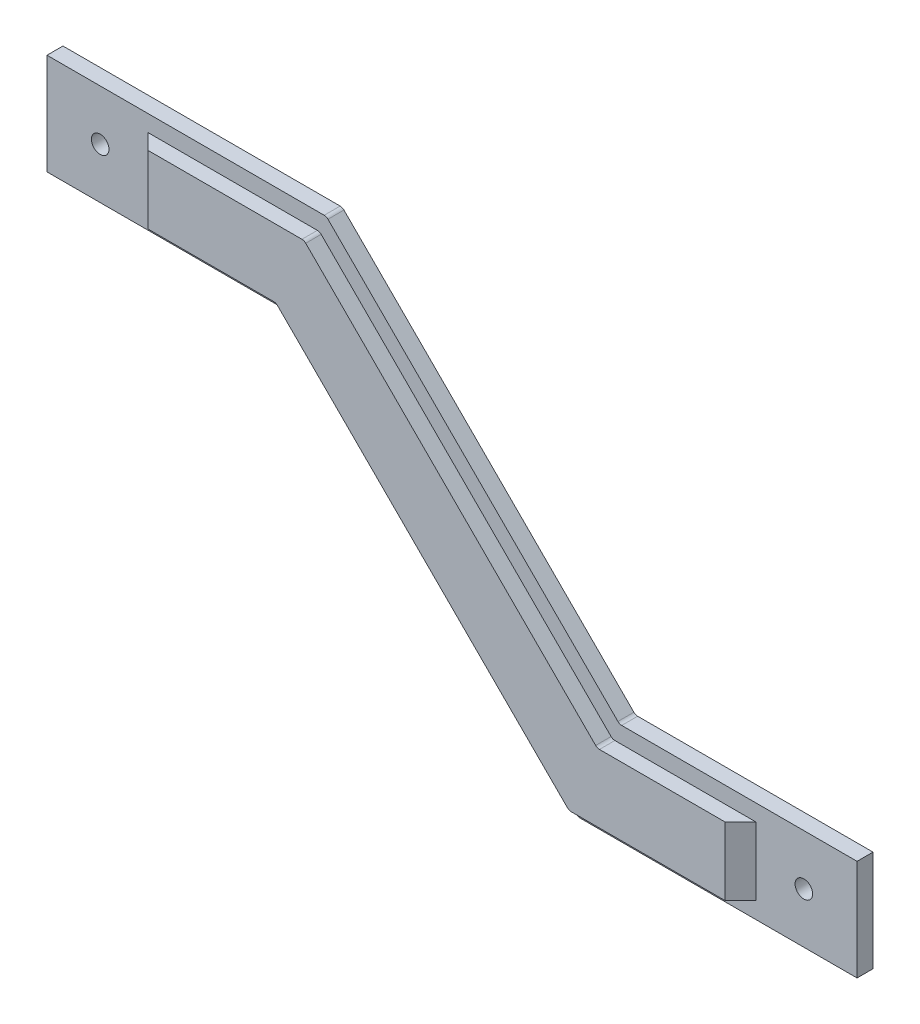
ISO-10303-21;
HEADER;
FILE_DESCRIPTION(('STEP AP214'),'2;1');
FILE_NAME('part.step','',(''),(''),'','','');
FILE_SCHEMA(('AUTOMOTIVE_DESIGN { 1 0 10303 214 1 1 1 1 }'));
ENDSEC;
DATA;
#1=APPLICATION_CONTEXT('core data for automotive mechanical design processes');
#2=APPLICATION_PROTOCOL_DEFINITION('international standard','automotive_design',2000,#1);
#3=PRODUCT_CONTEXT('',#1,'mechanical');
#4=PRODUCT('Part','Part','',(#3));
#5=PRODUCT_RELATED_PRODUCT_CATEGORY('part','',(#4));
#6=PRODUCT_DEFINITION_FORMATION('','',#4);
#7=PRODUCT_DEFINITION_CONTEXT('part definition',#1,'design');
#8=PRODUCT_DEFINITION('design','',#6,#7);
#9=PRODUCT_DEFINITION_SHAPE('','',#8);
#10=(LENGTH_UNIT() NAMED_UNIT(*) SI_UNIT(.MILLI.,.METRE.));
#11=(NAMED_UNIT(*) PLANE_ANGLE_UNIT() SI_UNIT($,.RADIAN.));
#12=(NAMED_UNIT(*) SI_UNIT($,.STERADIAN.) SOLID_ANGLE_UNIT());
#13=UNCERTAINTY_MEASURE_WITH_UNIT(LENGTH_MEASURE(1.E-05),#10,'distance_accuracy_value','');
#14=(GEOMETRIC_REPRESENTATION_CONTEXT(3) GLOBAL_UNCERTAINTY_ASSIGNED_CONTEXT((#13)) GLOBAL_UNIT_ASSIGNED_CONTEXT((#10,
#11,#12)) REPRESENTATION_CONTEXT('',''));
#15=CARTESIAN_POINT('',(0.,0.,0.));
#16=DIRECTION('',(0.,0.,1.));
#17=DIRECTION('',(1.,0.,0.));
#18=AXIS2_PLACEMENT_3D('',#15,#16,#17);
#19=CARTESIAN_POINT('',(0.,0.,3.));
#20=DIRECTION('',(0.,0.,-1.));
#21=DIRECTION('',(-1.,0.,0.));
#22=AXIS2_PLACEMENT_3D('',#19,#20,#21);
#23=PLANE('',#22);
#24=CARTESIAN_POINT('',(66.15,-27.55,3.));
#25=DIRECTION('',(0.,0.,1.));
#26=DIRECTION('',(1.,0.,0.));
#27=AXIS2_PLACEMENT_3D('',#24,#25,#26);
#28=CIRCLE('',#27,1.65);
#29=CARTESIAN_POINT('',(67.8,-27.55,3.));
#30=VERTEX_POINT('',#29);
#31=EDGE_CURVE('E379',#30,#30,#28,.T.);
#32=ORIENTED_EDGE('',*,*,#31,.F.);
#33=EDGE_LOOP('',(#32));
#34=FACE_BOUND('',#33,.T.);
#35=CARTESIAN_POINT('',(-66.15,27.55,3.));
#36=DIRECTION('',(0.,0.,1.));
#37=DIRECTION('',(1.,0.,0.));
#38=AXIS2_PLACEMENT_3D('',#35,#36,#37);
#39=CIRCLE('',#38,1.65);
#40=CARTESIAN_POINT('',(-64.5,27.55,3.));
#41=VERTEX_POINT('',#40);
#42=EDGE_CURVE('E331',#41,#41,#39,.T.);
#43=ORIENTED_EDGE('',*,*,#42,.F.);
#44=EDGE_LOOP('',(#43));
#45=FACE_BOUND('',#44,.T.);
#46=DIRECTION('',(-0.707106781186546,0.707106781186549,0.));
#47=VECTOR('',#46,1.);
#48=CARTESIAN_POINT('',(-23.6149711574555,37.05,3.));
#49=LINE('',#48,#47);
#50=CARTESIAN_POINT('',(31.1921356237317,-17.7571067811874,3.));
#51=VERTEX_POINT('',#50);
#52=CARTESIAN_POINT('',(-23.322077938642,36.7571067811865,3.));
#53=VERTEX_POINT('',#52);
#54=EDGE_CURVE('E368',#51,#53,#49,.T.);
#55=ORIENTED_EDGE('',*,*,#54,.T.);
#56=CARTESIAN_POINT('',(-24.0291847198286,36.05,3.));
#57=DIRECTION('',(0.,0.,-1.));
#58=DIRECTION('',(-1.,0.,0.));
#59=AXIS2_PLACEMENT_3D('',#56,#57,#58);
#60=CIRCLE('',#59,1.);
#61=CARTESIAN_POINT('',(-24.0291847198286,37.05,3.));
#62=VERTEX_POINT('',#61);
#63=EDGE_CURVE('E274',#53,#62,#60,.F.);
#64=ORIENTED_EDGE('',*,*,#63,.T.);
#65=DIRECTION('',(-1.,0.,0.));
#66=VECTOR('',#65,1.);
#67=CARTESIAN_POINT('',(-76.15,37.05,3.));
#68=LINE('',#67,#66);
#69=CARTESIAN_POINT('',(-76.15,37.05,3.));
#70=VERTEX_POINT('',#69);
#71=EDGE_CURVE('E213',#62,#70,#68,.T.);
#72=ORIENTED_EDGE('',*,*,#71,.T.);
#73=DIRECTION('',(0.,-1.,0.));
#74=VECTOR('',#73,1.);
#75=CARTESIAN_POINT('',(-76.15,18.05,3.));
#76=LINE('',#75,#74);
#77=CARTESIAN_POINT('',(-76.15,18.05,3.));
#78=VERTEX_POINT('',#77);
#79=EDGE_CURVE('E208',#70,#78,#76,.T.);
#80=ORIENTED_EDGE('',*,*,#79,.T.);
#81=DIRECTION('',(1.,0.,0.));
#82=VECTOR('',#81,1.);
#83=CARTESIAN_POINT('',(-31.4850288425443,18.05,3.));
#84=LINE('',#83,#82);
#85=CARTESIAN_POINT('',(-31.8992424049174,18.05,3.));
#86=VERTEX_POINT('',#85);
#87=EDGE_CURVE('E196',#78,#86,#84,.T.);
#88=ORIENTED_EDGE('',*,*,#87,.T.);
#89=CARTESIAN_POINT('',(-31.8992424049174,17.05,3.));
#90=DIRECTION('',(0.,0.,-1.));
#91=DIRECTION('',(-1.,0.,0.));
#92=AXIS2_PLACEMENT_3D('',#89,#90,#91);
#93=CIRCLE('',#92,1.);
#94=CARTESIAN_POINT('',(-31.1921356237309,17.7571067811866,3.));
#95=VERTEX_POINT('',#94);
#96=EDGE_CURVE('E44',#86,#95,#93,.T.);
#97=ORIENTED_EDGE('',*,*,#96,.T.);
#98=DIRECTION('',(0.707106781186547,-0.707106781186549,0.));
#99=VECTOR('',#98,1.);
#100=CARTESIAN_POINT('',(23.6149711574555,-37.05,3.));
#101=LINE('',#100,#99);
#102=CARTESIAN_POINT('',(23.3220779386421,-36.7571067811866,3.));
#103=VERTEX_POINT('',#102);
#104=EDGE_CURVE('E207',#95,#103,#101,.T.);
#105=ORIENTED_EDGE('',*,*,#104,.T.);
#106=CARTESIAN_POINT('',(24.0291847198286,-36.05,3.));
#107=DIRECTION('',(0.,0.,-1.));
#108=DIRECTION('',(-1.,0.,0.));
#109=AXIS2_PLACEMENT_3D('',#106,#107,#108);
#110=CIRCLE('',#109,1.);
#111=CARTESIAN_POINT('',(24.0291847198286,-37.05,3.));
#112=VERTEX_POINT('',#111);
#113=EDGE_CURVE('E270',#103,#112,#110,.F.);
#114=ORIENTED_EDGE('',*,*,#113,.T.);
#115=DIRECTION('',(1.,0.,0.));
#116=VECTOR('',#115,1.);
#117=CARTESIAN_POINT('',(76.15,-37.05,3.));
#118=LINE('',#117,#116);
#119=CARTESIAN_POINT('',(76.15,-37.05,3.));
#120=VERTEX_POINT('',#119);
#121=EDGE_CURVE('E319',#112,#120,#118,.T.);
#122=ORIENTED_EDGE('',*,*,#121,.T.);
#123=DIRECTION('',(0.,1.,0.));
#124=VECTOR('',#123,1.);
#125=CARTESIAN_POINT('',(76.15,-18.05,3.));
#126=LINE('',#125,#124);
#127=CARTESIAN_POINT('',(76.15,-18.05,3.));
#128=VERTEX_POINT('',#127);
#129=EDGE_CURVE('E371',#120,#128,#126,.T.);
#130=ORIENTED_EDGE('',*,*,#129,.T.);
#131=DIRECTION('',(-1.,0.,0.));
#132=VECTOR('',#131,1.);
#133=CARTESIAN_POINT('',(31.4850288425451,-18.0500000000008,3.));
#134=LINE('',#133,#132);
#135=CARTESIAN_POINT('',(31.8992424049183,-18.0500000000008,3.));
#136=VERTEX_POINT('',#135);
#137=EDGE_CURVE('E354',#128,#136,#134,.T.);
#138=ORIENTED_EDGE('',*,*,#137,.T.);
#139=CARTESIAN_POINT('',(31.8992424049182,-17.0500000000008,3.));
#140=DIRECTION('',(0.,0.,-1.));
#141=DIRECTION('',(-1.,0.,0.));
#142=AXIS2_PLACEMENT_3D('',#139,#140,#141);
#143=CIRCLE('',#142,1.);
#144=EDGE_CURVE('E303',#136,#51,#143,.T.);
#145=ORIENTED_EDGE('',*,*,#144,.T.);
#146=EDGE_LOOP('',(#55,#64,#72,#80,#88,#97,#105,#114,#122,#130,#138,#145));
#147=FACE_BOUND('',#146,.T.);
#148=DIRECTION('',(-0.707106781186548,0.707106781186548,0.));
#149=VECTOR('',#148,1.);
#150=CARTESIAN_POINT('',(30.2009667991878,-21.15,3.));
#151=LINE('',#150,#149);
#152=CARTESIAN_POINT('',(29.9080735803744,-20.8571067811866,3.));
#153=VERTEX_POINT('',#152);
#154=CARTESIAN_POINT('',(-24.6061399819987,33.6571067811865,3.));
#155=VERTEX_POINT('',#154);
#156=EDGE_CURVE('E388',#153,#155,#151,.T.);
#157=ORIENTED_EDGE('',*,*,#156,.F.);
#158=CARTESIAN_POINT('',(30.6151803615609,-20.15,3.));
#159=DIRECTION('',(0.,0.,-1.));
#160=DIRECTION('',(-1.,0.,0.));
#161=AXIS2_PLACEMENT_3D('',#158,#159,#160);
#162=CIRCLE('',#161,1.);
#163=CARTESIAN_POINT('',(30.6151803615609,-21.15,3.));
#164=VERTEX_POINT('',#163);
#165=EDGE_CURVE('E272',#153,#164,#162,.F.);
#166=ORIENTED_EDGE('',*,*,#165,.T.);
#167=DIRECTION('',(-1.,0.,0.));
#168=VECTOR('',#167,1.);
#169=CARTESIAN_POINT('',(57.15,-21.15,3.));
#170=LINE('',#169,#168);
#171=CARTESIAN_POINT('',(57.15,-21.15,3.));
#172=VERTEX_POINT('',#171);
#173=EDGE_CURVE('E392',#172,#164,#170,.T.);
#174=ORIENTED_EDGE('',*,*,#173,.F.);
#175=DIRECTION('',(0.,1.,0.));
#176=VECTOR('',#175,1.);
#177=CARTESIAN_POINT('',(57.15,-33.95,3.));
#178=LINE('',#177,#176);
#179=CARTESIAN_POINT('',(57.15,-33.95,3.));
#180=VERTEX_POINT('',#179);
#181=EDGE_CURVE('E395',#180,#172,#178,.T.);
#182=ORIENTED_EDGE('',*,*,#181,.F.);
#183=DIRECTION('',(1.,0.,0.));
#184=VECTOR('',#183,1.);
#185=CARTESIAN_POINT('',(24.8990332008122,-33.95,3.));
#186=LINE('',#185,#184);
#187=CARTESIAN_POINT('',(25.3132467631853,-33.95,3.));
#188=VERTEX_POINT('',#187);
#189=EDGE_CURVE('E398',#188,#180,#186,.T.);
#190=ORIENTED_EDGE('',*,*,#189,.F.);
#191=CARTESIAN_POINT('',(25.3132467631853,-32.95,3.));
#192=DIRECTION('',(0.,0.,-1.));
#193=DIRECTION('',(-1.,0.,0.));
#194=AXIS2_PLACEMENT_3D('',#191,#192,#193);
#195=CIRCLE('',#194,1.);
#196=CARTESIAN_POINT('',(24.6061399819988,-33.6571067811866,3.));
#197=VERTEX_POINT('',#196);
#198=EDGE_CURVE('E57',#188,#197,#195,.T.);
#199=ORIENTED_EDGE('',*,*,#198,.T.);
#200=DIRECTION('',(0.707106781186548,-0.707106781186547,0.));
#201=VECTOR('',#200,1.);
#202=CARTESIAN_POINT('',(-30.2009667991878,21.15,3.));
#203=LINE('',#202,#201);
#204=CARTESIAN_POINT('',(-29.9080735803744,20.8571067811865,3.));
#205=VERTEX_POINT('',#204);
#206=EDGE_CURVE('E400',#205,#197,#203,.T.);
#207=ORIENTED_EDGE('',*,*,#206,.F.);
#208=CARTESIAN_POINT('',(-30.6151803615609,20.15,3.));
#209=DIRECTION('',(0.,0.,-1.));
#210=DIRECTION('',(-1.,0.,0.));
#211=AXIS2_PLACEMENT_3D('',#208,#209,#210);
#212=CIRCLE('',#211,1.);
#213=CARTESIAN_POINT('',(-30.6151803615609,21.15,3.));
#214=VERTEX_POINT('',#213);
#215=EDGE_CURVE('E51',#205,#214,#212,.F.);
#216=ORIENTED_EDGE('',*,*,#215,.T.);
#217=DIRECTION('',(1.,0.,0.));
#218=VECTOR('',#217,1.);
#219=CARTESIAN_POINT('',(-57.15,21.15,3.));
#220=LINE('',#219,#218);
#221=CARTESIAN_POINT('',(-57.15,21.15,3.));
#222=VERTEX_POINT('',#221);
#223=EDGE_CURVE('E402',#222,#214,#220,.T.);
#224=ORIENTED_EDGE('',*,*,#223,.F.);
#225=DIRECTION('',(0.,-1.,0.));
#226=VECTOR('',#225,1.);
#227=CARTESIAN_POINT('',(-57.15,33.95,3.));
#228=LINE('',#227,#226);
#229=CARTESIAN_POINT('',(-57.15,33.95,3.));
#230=VERTEX_POINT('',#229);
#231=EDGE_CURVE('E404',#230,#222,#228,.T.);
#232=ORIENTED_EDGE('',*,*,#231,.F.);
#233=DIRECTION('',(-1.,0.,0.));
#234=VECTOR('',#233,1.);
#235=CARTESIAN_POINT('',(-24.8990332008122,33.95,3.));
#236=LINE('',#235,#234);
#237=CARTESIAN_POINT('',(-25.3132467631853,33.95,3.));
#238=VERTEX_POINT('',#237);
#239=EDGE_CURVE('E407',#238,#230,#236,.T.);
#240=ORIENTED_EDGE('',*,*,#239,.F.);
#241=CARTESIAN_POINT('',(-25.3132467631853,32.95,3.));
#242=DIRECTION('',(0.,0.,-1.));
#243=DIRECTION('',(-1.,0.,0.));
#244=AXIS2_PLACEMENT_3D('',#241,#242,#243);
#245=CIRCLE('',#244,1.);
#246=EDGE_CURVE('E299',#238,#155,#245,.T.);
#247=ORIENTED_EDGE('',*,*,#246,.T.);
#248=EDGE_LOOP('',(#157,#166,#174,#182,#190,#199,#207,#216,#224,#232,#240,#247));
#249=FACE_BOUND('',#248,.T.);
#250=ADVANCED_FACE('F36',(#34,#45,#147,#249),#23,.F.);
#251=CARTESIAN_POINT('',(0.,0.,0.));
#252=DIRECTION('',(0.,0.,-1.));
#253=DIRECTION('',(-1.,0.,0.));
#254=AXIS2_PLACEMENT_3D('',#251,#252,#253);
#255=PLANE('',#254);
#256=CARTESIAN_POINT('',(-66.15,27.55,0.));
#257=DIRECTION('',(0.,0.,1.));
#258=DIRECTION('',(1.,0.,0.));
#259=AXIS2_PLACEMENT_3D('',#256,#257,#258);
#260=CIRCLE('',#259,1.65);
#261=CARTESIAN_POINT('',(-64.5,27.55,0.));
#262=VERTEX_POINT('',#261);
#263=EDGE_CURVE('E376',#262,#262,#260,.T.);
#264=ORIENTED_EDGE('',*,*,#263,.T.);
#265=EDGE_LOOP('',(#264));
#266=FACE_BOUND('',#265,.T.);
#267=DIRECTION('',(-1.,0.,0.));
#268=VECTOR('',#267,1.);
#269=CARTESIAN_POINT('',(-76.15,37.05,0.));
#270=LINE('',#269,#268);
#271=CARTESIAN_POINT('',(-24.0291847198286,37.05,0.));
#272=VERTEX_POINT('',#271);
#273=CARTESIAN_POINT('',(-76.15,37.05,0.));
#274=VERTEX_POINT('',#273);
#275=EDGE_CURVE('E217',#272,#274,#270,.T.);
#276=ORIENTED_EDGE('',*,*,#275,.F.);
#277=CARTESIAN_POINT('',(-24.0291847198286,36.05,0.));
#278=DIRECTION('',(0.,0.,-1.));
#279=DIRECTION('',(-1.,0.,0.));
#280=AXIS2_PLACEMENT_3D('',#277,#278,#279);
#281=CIRCLE('',#280,1.);
#282=CARTESIAN_POINT('',(-23.322077938642,36.7571067811865,0.));
#283=VERTEX_POINT('',#282);
#284=EDGE_CURVE('E262',#272,#283,#281,.T.);
#285=ORIENTED_EDGE('',*,*,#284,.T.);
#286=DIRECTION('',(-0.707106781186546,0.707106781186549,0.));
#287=VECTOR('',#286,1.);
#288=CARTESIAN_POINT('',(-23.6149711574555,37.05,0.));
#289=LINE('',#288,#287);
#290=CARTESIAN_POINT('',(31.1921356237317,-17.7571067811874,0.));
#291=VERTEX_POINT('',#290);
#292=EDGE_CURVE('E341',#291,#283,#289,.T.);
#293=ORIENTED_EDGE('',*,*,#292,.F.);
#294=CARTESIAN_POINT('',(31.8992424049182,-17.0500000000008,0.));
#295=DIRECTION('',(0.,0.,-1.));
#296=DIRECTION('',(-1.,0.,0.));
#297=AXIS2_PLACEMENT_3D('',#294,#295,#296);
#298=CIRCLE('',#297,1.);
#299=CARTESIAN_POINT('',(31.8992424049183,-18.0500000000008,0.));
#300=VERTEX_POINT('',#299);
#301=EDGE_CURVE('E301',#291,#300,#298,.F.);
#302=ORIENTED_EDGE('',*,*,#301,.T.);
#303=DIRECTION('',(-1.,0.,0.));
#304=VECTOR('',#303,1.);
#305=CARTESIAN_POINT('',(31.4850288425451,-18.0500000000008,0.));
#306=LINE('',#305,#304);
#307=CARTESIAN_POINT('',(76.15,-18.05,0.));
#308=VERTEX_POINT('',#307);
#309=EDGE_CURVE('E338',#308,#300,#306,.T.);
#310=ORIENTED_EDGE('',*,*,#309,.F.);
#311=DIRECTION('',(0.,1.,0.));
#312=VECTOR('',#311,1.);
#313=CARTESIAN_POINT('',(76.15,-18.05,0.));
#314=LINE('',#313,#312);
#315=CARTESIAN_POINT('',(76.15,-37.05,0.));
#316=VERTEX_POINT('',#315);
#317=EDGE_CURVE('E336',#316,#308,#314,.T.);
#318=ORIENTED_EDGE('',*,*,#317,.F.);
#319=DIRECTION('',(1.,0.,0.));
#320=VECTOR('',#319,1.);
#321=CARTESIAN_POINT('',(76.15,-37.05,0.));
#322=LINE('',#321,#320);
#323=CARTESIAN_POINT('',(24.0291847198286,-37.05,0.));
#324=VERTEX_POINT('',#323);
#325=EDGE_CURVE('E329',#324,#316,#322,.T.);
#326=ORIENTED_EDGE('',*,*,#325,.F.);
#327=CARTESIAN_POINT('',(24.0291847198286,-36.05,0.));
#328=DIRECTION('',(0.,0.,-1.));
#329=DIRECTION('',(-1.,0.,0.));
#330=AXIS2_PLACEMENT_3D('',#327,#328,#329);
#331=CIRCLE('',#330,1.);
#332=CARTESIAN_POINT('',(23.3220779386421,-36.7571067811866,0.));
#333=VERTEX_POINT('',#332);
#334=EDGE_CURVE('E260',#324,#333,#331,.T.);
#335=ORIENTED_EDGE('',*,*,#334,.T.);
#336=DIRECTION('',(0.707106781186547,-0.707106781186549,0.));
#337=VECTOR('',#336,1.);
#338=CARTESIAN_POINT('',(23.6149711574555,-37.05,0.));
#339=LINE('',#338,#337);
#340=CARTESIAN_POINT('',(-31.1921356237309,17.7571067811866,0.));
#341=VERTEX_POINT('',#340);
#342=EDGE_CURVE('E327',#341,#333,#339,.T.);
#343=ORIENTED_EDGE('',*,*,#342,.F.);
#344=CARTESIAN_POINT('',(-31.8992424049174,17.05,0.));
#345=DIRECTION('',(0.,0.,-1.));
#346=DIRECTION('',(-1.,0.,0.));
#347=AXIS2_PLACEMENT_3D('',#344,#345,#346);
#348=CIRCLE('',#347,1.);
#349=CARTESIAN_POINT('',(-31.8992424049174,18.05,0.));
#350=VERTEX_POINT('',#349);
#351=EDGE_CURVE('E308',#341,#350,#348,.F.);
#352=ORIENTED_EDGE('',*,*,#351,.T.);
#353=DIRECTION('',(1.,0.,0.));
#354=VECTOR('',#353,1.);
#355=CARTESIAN_POINT('',(-31.4850288425443,18.05,0.));
#356=LINE('',#355,#354);
#357=CARTESIAN_POINT('',(-76.15,18.05,0.));
#358=VERTEX_POINT('',#357);
#359=EDGE_CURVE('E326',#358,#350,#356,.T.);
#360=ORIENTED_EDGE('',*,*,#359,.F.);
#361=DIRECTION('',(0.,-1.,0.));
#362=VECTOR('',#361,1.);
#363=CARTESIAN_POINT('',(-76.15,18.05,0.));
#364=LINE('',#363,#362);
#365=EDGE_CURVE('E221',#274,#358,#364,.T.);
#366=ORIENTED_EDGE('',*,*,#365,.F.);
#367=EDGE_LOOP('',(#276,#285,#293,#302,#310,#318,#326,#335,#343,#352,#360,#366));
#368=FACE_BOUND('',#367,.T.);
#369=CARTESIAN_POINT('',(66.15,-27.55,0.));
#370=DIRECTION('',(0.,0.,1.));
#371=DIRECTION('',(1.,0.,0.));
#372=AXIS2_PLACEMENT_3D('',#369,#370,#371);
#373=CIRCLE('',#372,1.65);
#374=CARTESIAN_POINT('',(67.8,-27.55,0.));
#375=VERTEX_POINT('',#374);
#376=EDGE_CURVE('E382',#375,#375,#373,.T.);
#377=ORIENTED_EDGE('',*,*,#376,.T.);
#378=EDGE_LOOP('',(#377));
#379=FACE_BOUND('',#378,.T.);
#380=ADVANCED_FACE('F324',(#266,#368,#379),#255,.T.);
#381=CARTESIAN_POINT('',(-76.15,18.05,3.));
#382=DIRECTION('',(1.,0.,0.));
#383=DIRECTION('',(0.,0.,-1.));
#384=AXIS2_PLACEMENT_3D('',#381,#382,#383);
#385=PLANE('',#384);
#386=ORIENTED_EDGE('',*,*,#365,.T.);
#387=DIRECTION('',(0.,0.,-1.));
#388=VECTOR('',#387,1.);
#389=CARTESIAN_POINT('',(-76.15,18.05,3.));
#390=LINE('',#389,#388);
#391=EDGE_CURVE('E201',#78,#358,#390,.T.);
#392=ORIENTED_EDGE('',*,*,#391,.F.);
#393=ORIENTED_EDGE('',*,*,#79,.F.);
#394=DIRECTION('',(0.,0.,-1.));
#395=VECTOR('',#394,1.);
#396=CARTESIAN_POINT('',(-76.15,37.05,3.));
#397=LINE('',#396,#395);
#398=EDGE_CURVE('E345',#70,#274,#397,.T.);
#399=ORIENTED_EDGE('',*,*,#398,.T.);
#400=EDGE_LOOP('',(#386,#392,#393,#399));
#401=FACE_BOUND('',#400,.T.);
#402=ADVANCED_FACE('F219',(#401),#385,.F.);
#403=CARTESIAN_POINT('',(-31.4850288425443,18.05,3.));
#404=DIRECTION('',(0.,1.,0.));
#405=DIRECTION('',(-1.,0.,0.));
#406=AXIS2_PLACEMENT_3D('',#403,#404,#405);
#407=PLANE('',#406);
#408=ORIENTED_EDGE('',*,*,#359,.T.);
#409=DIRECTION('',(0.,0.,-1.));
#410=VECTOR('',#409,1.);
#411=CARTESIAN_POINT('',(-31.8992424049174,18.05,3.));
#412=LINE('',#411,#410);
#413=EDGE_CURVE('E204',#350,#86,#412,.F.);
#414=ORIENTED_EDGE('',*,*,#413,.T.);
#415=ORIENTED_EDGE('',*,*,#87,.F.);
#416=ORIENTED_EDGE('',*,*,#391,.T.);
#417=EDGE_LOOP('',(#408,#414,#415,#416));
#418=FACE_BOUND('',#417,.T.);
#419=ADVANCED_FACE('F199',(#418),#407,.F.);
#420=CARTESIAN_POINT('',(23.6149711574555,-37.05,3.));
#421=DIRECTION('',(0.707106781186548,0.707106781186546,0.));
#422=DIRECTION('',(-0.707106781186547,0.707106781186549,0.));
#423=AXIS2_PLACEMENT_3D('',#420,#421,#422);
#424=PLANE('',#423);
#425=ORIENTED_EDGE('',*,*,#342,.T.);
#426=DIRECTION('',(0.,0.,-1.));
#427=VECTOR('',#426,1.);
#428=CARTESIAN_POINT('',(23.3220779386421,-36.7571067811866,3.));
#429=LINE('',#428,#427);
#430=EDGE_CURVE('E286',#333,#103,#429,.F.);
#431=ORIENTED_EDGE('',*,*,#430,.T.);
#432=ORIENTED_EDGE('',*,*,#104,.F.);
#433=DIRECTION('',(0.,0.,-1.));
#434=VECTOR('',#433,1.);
#435=CARTESIAN_POINT('',(-31.1921356237309,17.7571067811866,0.));
#436=LINE('',#435,#434);
#437=EDGE_CURVE('E283',#95,#341,#436,.T.);
#438=ORIENTED_EDGE('',*,*,#437,.T.);
#439=EDGE_LOOP('',(#425,#431,#432,#438));
#440=FACE_BOUND('',#439,.T.);
#441=ADVANCED_FACE('F316',(#440),#424,.F.);
#442=CARTESIAN_POINT('',(76.15,-37.05,3.));
#443=DIRECTION('',(0.,1.,0.));
#444=DIRECTION('',(-1.,0.,0.));
#445=AXIS2_PLACEMENT_3D('',#442,#443,#444);
#446=PLANE('',#445);
#447=ORIENTED_EDGE('',*,*,#121,.F.);
#448=DIRECTION('',(0.,0.,-1.));
#449=VECTOR('',#448,1.);
#450=CARTESIAN_POINT('',(24.0291847198286,-37.05,3.));
#451=LINE('',#450,#449);
#452=EDGE_CURVE('E280',#112,#324,#451,.T.);
#453=ORIENTED_EDGE('',*,*,#452,.T.);
#454=ORIENTED_EDGE('',*,*,#325,.T.);
#455=DIRECTION('',(0.,0.,-1.));
#456=VECTOR('',#455,1.);
#457=CARTESIAN_POINT('',(76.15,-37.05,3.));
#458=LINE('',#457,#456);
#459=EDGE_CURVE('E223',#120,#316,#458,.T.);
#460=ORIENTED_EDGE('',*,*,#459,.F.);
#461=EDGE_LOOP('',(#447,#453,#454,#460));
#462=FACE_BOUND('',#461,.T.);
#463=ADVANCED_FACE('F483',(#462),#446,.F.);
#464=CARTESIAN_POINT('',(76.15,-18.05,3.));
#465=DIRECTION('',(-1.,0.,0.));
#466=DIRECTION('',(0.,0.,1.));
#467=AXIS2_PLACEMENT_3D('',#464,#465,#466);
#468=PLANE('',#467);
#469=ORIENTED_EDGE('',*,*,#317,.T.);
#470=DIRECTION('',(0.,0.,-1.));
#471=VECTOR('',#470,1.);
#472=CARTESIAN_POINT('',(76.15,-18.05,3.));
#473=LINE('',#472,#471);
#474=EDGE_CURVE('E229',#128,#308,#473,.T.);
#475=ORIENTED_EDGE('',*,*,#474,.F.);
#476=ORIENTED_EDGE('',*,*,#129,.F.);
#477=ORIENTED_EDGE('',*,*,#459,.T.);
#478=EDGE_LOOP('',(#469,#475,#476,#477));
#479=FACE_BOUND('',#478,.T.);
#480=ADVANCED_FACE('F480',(#479),#468,.F.);
#481=CARTESIAN_POINT('',(31.4850288425451,-18.0500000000008,3.));
#482=DIRECTION('',(0.,-1.,0.));
#483=DIRECTION('',(1.,0.,0.));
#484=AXIS2_PLACEMENT_3D('',#481,#482,#483);
#485=PLANE('',#484);
#486=ORIENTED_EDGE('',*,*,#309,.T.);
#487=DIRECTION('',(0.,0.,-1.));
#488=VECTOR('',#487,1.);
#489=CARTESIAN_POINT('',(31.8992424049183,-18.0500000000008,3.));
#490=LINE('',#489,#488);
#491=EDGE_CURVE('E276',#300,#136,#490,.F.);
#492=ORIENTED_EDGE('',*,*,#491,.T.);
#493=ORIENTED_EDGE('',*,*,#137,.F.);
#494=ORIENTED_EDGE('',*,*,#474,.T.);
#495=EDGE_LOOP('',(#486,#492,#493,#494));
#496=FACE_BOUND('',#495,.T.);
#497=ADVANCED_FACE('F351',(#496),#485,.F.);
#498=CARTESIAN_POINT('',(-23.6149711574555,37.05,3.));
#499=DIRECTION('',(-0.707106781186549,-0.707106781186546,0.));
#500=DIRECTION('',(0.707106781186546,-0.707106781186549,0.));
#501=AXIS2_PLACEMENT_3D('',#498,#499,#500);
#502=PLANE('',#501);
#503=ORIENTED_EDGE('',*,*,#292,.T.);
#504=DIRECTION('',(0.,0.,-1.));
#505=VECTOR('',#504,1.);
#506=CARTESIAN_POINT('',(-23.322077938642,36.7571067811865,3.));
#507=LINE('',#506,#505);
#508=EDGE_CURVE('E267',#283,#53,#507,.F.);
#509=ORIENTED_EDGE('',*,*,#508,.T.);
#510=ORIENTED_EDGE('',*,*,#54,.F.);
#511=DIRECTION('',(0.,0.,-1.));
#512=VECTOR('',#511,1.);
#513=CARTESIAN_POINT('',(31.1921356237317,-17.7571067811874,0.));
#514=LINE('',#513,#512);
#515=EDGE_CURVE('E264',#51,#291,#514,.T.);
#516=ORIENTED_EDGE('',*,*,#515,.T.);
#517=EDGE_LOOP('',(#503,#509,#510,#516));
#518=FACE_BOUND('',#517,.T.);
#519=ADVANCED_FACE('F366',(#518),#502,.F.);
#520=CARTESIAN_POINT('',(-76.15,37.05,3.));
#521=DIRECTION('',(0.,-1.,0.));
#522=DIRECTION('',(0.,0.,-1.));
#523=AXIS2_PLACEMENT_3D('',#520,#521,#522);
#524=PLANE('',#523);
#525=ORIENTED_EDGE('',*,*,#71,.F.);
#526=DIRECTION('',(0.,0.,-1.));
#527=VECTOR('',#526,1.);
#528=CARTESIAN_POINT('',(-24.0291847198286,37.05,3.));
#529=LINE('',#528,#527);
#530=EDGE_CURVE('E257',#62,#272,#529,.T.);
#531=ORIENTED_EDGE('',*,*,#530,.T.);
#532=ORIENTED_EDGE('',*,*,#275,.T.);
#533=ORIENTED_EDGE('',*,*,#398,.F.);
#534=EDGE_LOOP('',(#525,#531,#532,#533));
#535=FACE_BOUND('',#534,.T.);
#536=ADVANCED_FACE('F472',(#535),#524,.F.);
#537=CARTESIAN_POINT('',(-66.15,27.55,3.));
#538=DIRECTION('',(0.,0.,-1.));
#539=DIRECTION('',(-1.,0.,0.));
#540=AXIS2_PLACEMENT_3D('',#537,#538,#539);
#541=CYLINDRICAL_SURFACE('',#540,1.65);
#542=ORIENTED_EDGE('',*,*,#42,.T.);
#543=EDGE_LOOP('',(#542));
#544=FACE_BOUND('',#543,.T.);
#545=ORIENTED_EDGE('',*,*,#263,.F.);
#546=EDGE_LOOP('',(#545));
#547=FACE_BOUND('',#546,.T.);
#548=ADVANCED_FACE('F469',(#544,#547),#541,.F.);
#549=CARTESIAN_POINT('',(66.15,-27.55,3.));
#550=DIRECTION('',(0.,0.,-1.));
#551=DIRECTION('',(-1.,0.,0.));
#552=AXIS2_PLACEMENT_3D('',#549,#550,#551);
#553=CYLINDRICAL_SURFACE('',#552,1.65);
#554=ORIENTED_EDGE('',*,*,#31,.T.);
#555=EDGE_LOOP('',(#554));
#556=FACE_BOUND('',#555,.T.);
#557=ORIENTED_EDGE('',*,*,#376,.F.);
#558=EDGE_LOOP('',(#557));
#559=FACE_BOUND('',#558,.T.);
#560=ADVANCED_FACE('F644',(#556,#559),#553,.F.);
#561=CARTESIAN_POINT('',(-24.8990332008122,33.95,5.9));
#562=DIRECTION('',(0.,-1.,0.));
#563=DIRECTION('',(0.,0.,-1.));
#564=AXIS2_PLACEMENT_3D('',#561,#562,#563);
#565=PLANE('',#564);
#566=DIRECTION('',(-1.,0.,0.));
#567=VECTOR('',#566,1.);
#568=CARTESIAN_POINT('',(-24.8990332008122,33.95,5.9));
#569=LINE('',#568,#567);
#570=CARTESIAN_POINT('',(-25.3132467631853,33.95,5.9));
#571=VERTEX_POINT('',#570);
#572=CARTESIAN_POINT('',(-54.25,33.95,5.9));
#573=VERTEX_POINT('',#572);
#574=EDGE_CURVE('E391',#571,#573,#569,.T.);
#575=ORIENTED_EDGE('',*,*,#574,.F.);
#576=DIRECTION('',(0.,0.,-1.));
#577=VECTOR('',#576,1.);
#578=CARTESIAN_POINT('',(-25.3132467631853,33.95,5.9));
#579=LINE('',#578,#577);
#580=EDGE_CURVE('E245',#571,#238,#579,.T.);
#581=ORIENTED_EDGE('',*,*,#580,.T.);
#582=ORIENTED_EDGE('',*,*,#239,.T.);
#583=DIRECTION('',(0.707106781186546,0.,0.707106781186549));
#584=VECTOR('',#583,1.);
#585=CARTESIAN_POINT('',(-54.25,33.95,5.9));
#586=LINE('',#585,#584);
#587=EDGE_CURVE('E242',#230,#573,#586,.T.);
#588=ORIENTED_EDGE('',*,*,#587,.T.);
#589=EDGE_LOOP('',(#575,#581,#582,#588));
#590=FACE_BOUND('',#589,.T.);
#591=ADVANCED_FACE('F431',(#590),#565,.F.);
#592=CARTESIAN_POINT('',(-57.15,21.15,5.9));
#593=DIRECTION('',(0.,1.,0.));
#594=DIRECTION('',(0.,0.,1.));
#595=AXIS2_PLACEMENT_3D('',#592,#593,#594);
#596=PLANE('',#595);
#597=ORIENTED_EDGE('',*,*,#223,.T.);
#598=DIRECTION('',(0.,0.,-1.));
#599=VECTOR('',#598,1.);
#600=CARTESIAN_POINT('',(-30.6151803615609,21.15,5.9));
#601=LINE('',#600,#599);
#602=CARTESIAN_POINT('',(-30.6151803615609,21.15,5.9));
#603=VERTEX_POINT('',#602);
#604=EDGE_CURVE('E297',#214,#603,#601,.F.);
#605=ORIENTED_EDGE('',*,*,#604,.T.);
#606=DIRECTION('',(1.,0.,0.));
#607=VECTOR('',#606,1.);
#608=CARTESIAN_POINT('',(-57.15,21.15,5.9));
#609=LINE('',#608,#607);
#610=CARTESIAN_POINT('',(-54.25,21.15,5.9));
#611=VERTEX_POINT('',#610);
#612=EDGE_CURVE('E419',#611,#603,#609,.T.);
#613=ORIENTED_EDGE('',*,*,#612,.F.);
#614=DIRECTION('',(-0.707106781186546,0.,-0.707106781186549));
#615=VECTOR('',#614,1.);
#616=CARTESIAN_POINT('',(-54.25,21.15,5.9));
#617=LINE('',#616,#615);
#618=EDGE_CURVE('E240',#611,#222,#617,.T.);
#619=ORIENTED_EDGE('',*,*,#618,.T.);
#620=EDGE_LOOP('',(#597,#605,#613,#619));
#621=FACE_BOUND('',#620,.T.);
#622=ADVANCED_FACE('F437',(#621),#596,.F.);
#623=CARTESIAN_POINT('',(-30.2009667991878,21.15,5.9));
#624=DIRECTION('',(0.707106781186547,0.707106781186548,0.));
#625=DIRECTION('',(-0.707106781186548,0.707106781186547,0.));
#626=AXIS2_PLACEMENT_3D('',#623,#624,#625);
#627=PLANE('',#626);
#628=ORIENTED_EDGE('',*,*,#206,.T.);
#629=DIRECTION('',(0.,0.,-1.));
#630=VECTOR('',#629,1.);
#631=CARTESIAN_POINT('',(24.6061399819988,-33.6571067811866,5.9));
#632=LINE('',#631,#630);
#633=CARTESIAN_POINT('',(24.6061399819988,-33.6571067811866,5.9));
#634=VERTEX_POINT('',#633);
#635=EDGE_CURVE('E294',#197,#634,#632,.F.);
#636=ORIENTED_EDGE('',*,*,#635,.T.);
#637=DIRECTION('',(0.707106781186548,-0.707106781186547,0.));
#638=VECTOR('',#637,1.);
#639=CARTESIAN_POINT('',(-30.2009667991878,21.15,5.9));
#640=LINE('',#639,#638);
#641=CARTESIAN_POINT('',(-29.9080735803744,20.8571067811865,5.9));
#642=VERTEX_POINT('',#641);
#643=EDGE_CURVE('E416',#642,#634,#640,.T.);
#644=ORIENTED_EDGE('',*,*,#643,.F.);
#645=DIRECTION('',(0.,0.,-1.));
#646=VECTOR('',#645,1.);
#647=CARTESIAN_POINT('',(-29.9080735803744,20.8571067811865,3.));
#648=LINE('',#647,#646);
#649=EDGE_CURVE('E291',#642,#205,#648,.T.);
#650=ORIENTED_EDGE('',*,*,#649,.T.);
#651=EDGE_LOOP('',(#628,#636,#644,#650));
#652=FACE_BOUND('',#651,.T.);
#653=ADVANCED_FACE('F526',(#652),#627,.F.);
#654=CARTESIAN_POINT('',(24.8990332008122,-33.95,5.9));
#655=DIRECTION('',(0.,1.,0.));
#656=DIRECTION('',(0.,0.,1.));
#657=AXIS2_PLACEMENT_3D('',#654,#655,#656);
#658=PLANE('',#657);
#659=DIRECTION('',(1.,0.,0.));
#660=VECTOR('',#659,1.);
#661=CARTESIAN_POINT('',(24.8990332008122,-33.95,5.9));
#662=LINE('',#661,#660);
#663=CARTESIAN_POINT('',(25.3132467631853,-33.95,5.9));
#664=VERTEX_POINT('',#663);
#665=CARTESIAN_POINT('',(54.25,-33.95,5.9));
#666=VERTEX_POINT('',#665);
#667=EDGE_CURVE('E414',#664,#666,#662,.T.);
#668=ORIENTED_EDGE('',*,*,#667,.F.);
#669=DIRECTION('',(0.,0.,-1.));
#670=VECTOR('',#669,1.);
#671=CARTESIAN_POINT('',(25.3132467631853,-33.95,5.9));
#672=LINE('',#671,#670);
#673=EDGE_CURVE('E288',#664,#188,#672,.T.);
#674=ORIENTED_EDGE('',*,*,#673,.T.);
#675=ORIENTED_EDGE('',*,*,#189,.T.);
#676=DIRECTION('',(-0.707106781186546,0.,0.707106781186549));
#677=VECTOR('',#676,1.);
#678=CARTESIAN_POINT('',(54.25,-33.95,5.9));
#679=LINE('',#678,#677);
#680=EDGE_CURVE('E237',#180,#666,#679,.T.);
#681=ORIENTED_EDGE('',*,*,#680,.T.);
#682=EDGE_LOOP('',(#668,#674,#675,#681));
#683=FACE_BOUND('',#682,.T.);
#684=ADVANCED_FACE('F510',(#683),#658,.F.);
#685=CARTESIAN_POINT('',(57.15,-21.15,5.9));
#686=DIRECTION('',(0.,-1.,0.));
#687=DIRECTION('',(0.,0.,-1.));
#688=AXIS2_PLACEMENT_3D('',#685,#686,#687);
#689=PLANE('',#688);
#690=ORIENTED_EDGE('',*,*,#173,.T.);
#691=DIRECTION('',(0.,0.,-1.));
#692=VECTOR('',#691,1.);
#693=CARTESIAN_POINT('',(30.6151803615609,-21.15,5.9));
#694=LINE('',#693,#692);
#695=CARTESIAN_POINT('',(30.6151803615609,-21.15,5.9));
#696=VERTEX_POINT('',#695);
#697=EDGE_CURVE('E278',#164,#696,#694,.F.);
#698=ORIENTED_EDGE('',*,*,#697,.T.);
#699=DIRECTION('',(-1.,0.,0.));
#700=VECTOR('',#699,1.);
#701=CARTESIAN_POINT('',(57.15,-21.15,5.9));
#702=LINE('',#701,#700);
#703=CARTESIAN_POINT('',(54.25,-21.15,5.9));
#704=VERTEX_POINT('',#703);
#705=EDGE_CURVE('E411',#704,#696,#702,.T.);
#706=ORIENTED_EDGE('',*,*,#705,.F.);
#707=DIRECTION('',(0.707106781186546,0.,-0.707106781186549));
#708=VECTOR('',#707,1.);
#709=CARTESIAN_POINT('',(54.25,-21.15,5.9));
#710=LINE('',#709,#708);
#711=EDGE_CURVE('E235',#704,#172,#710,.T.);
#712=ORIENTED_EDGE('',*,*,#711,.T.);
#713=EDGE_LOOP('',(#690,#698,#706,#712));
#714=FACE_BOUND('',#713,.T.);
#715=ADVANCED_FACE('F515',(#714),#689,.F.);
#716=CARTESIAN_POINT('',(30.2009667991878,-21.15,5.9));
#717=DIRECTION('',(-0.707106781186547,-0.707106781186547,0.));
#718=DIRECTION('',(0.707106781186548,-0.707106781186548,0.));
#719=AXIS2_PLACEMENT_3D('',#716,#717,#718);
#720=PLANE('',#719);
#721=ORIENTED_EDGE('',*,*,#156,.T.);
#722=DIRECTION('',(0.,0.,-1.));
#723=VECTOR('',#722,1.);
#724=CARTESIAN_POINT('',(-24.6061399819987,33.6571067811865,5.9));
#725=LINE('',#724,#723);
#726=CARTESIAN_POINT('',(-24.6061399819987,33.6571067811865,5.9));
#727=VERTEX_POINT('',#726);
#728=EDGE_CURVE('E251',#155,#727,#725,.F.);
#729=ORIENTED_EDGE('',*,*,#728,.T.);
#730=DIRECTION('',(-0.707106781186548,0.707106781186548,0.));
#731=VECTOR('',#730,1.);
#732=CARTESIAN_POINT('',(30.2009667991878,-21.15,5.9));
#733=LINE('',#732,#731);
#734=CARTESIAN_POINT('',(29.9080735803744,-20.8571067811866,5.9));
#735=VERTEX_POINT('',#734);
#736=EDGE_CURVE('E385',#735,#727,#733,.T.);
#737=ORIENTED_EDGE('',*,*,#736,.F.);
#738=DIRECTION('',(0.,0.,-1.));
#739=VECTOR('',#738,1.);
#740=CARTESIAN_POINT('',(29.9080735803744,-20.8571067811866,3.));
#741=LINE('',#740,#739);
#742=EDGE_CURVE('E248',#735,#153,#741,.T.);
#743=ORIENTED_EDGE('',*,*,#742,.T.);
#744=EDGE_LOOP('',(#721,#729,#737,#743));
#745=FACE_BOUND('',#744,.T.);
#746=ADVANCED_FACE('F443',(#745),#720,.F.);
#747=CARTESIAN_POINT('',(0.,0.,5.9));
#748=DIRECTION('',(0.,0.,1.));
#749=DIRECTION('',(1.,0.,0.));
#750=AXIS2_PLACEMENT_3D('',#747,#748,#749);
#751=PLANE('',#750);
#752=ORIENTED_EDGE('',*,*,#736,.T.);
#753=CARTESIAN_POINT('',(-25.3132467631853,32.95,5.9));
#754=DIRECTION('',(0.,0.,1.));
#755=DIRECTION('',(1.,0.,0.));
#756=AXIS2_PLACEMENT_3D('',#753,#754,#755);
#757=CIRCLE('',#756,1.);
#758=EDGE_CURVE('E255',#727,#571,#757,.T.);
#759=ORIENTED_EDGE('',*,*,#758,.T.);
#760=ORIENTED_EDGE('',*,*,#574,.T.);
#761=DIRECTION('',(0.,-1.,0.));
#762=VECTOR('',#761,1.);
#763=CARTESIAN_POINT('',(-54.25,21.15,5.9));
#764=LINE('',#763,#762);
#765=EDGE_CURVE('E222',#573,#611,#764,.T.);
#766=ORIENTED_EDGE('',*,*,#765,.T.);
#767=ORIENTED_EDGE('',*,*,#612,.T.);
#768=CARTESIAN_POINT('',(-30.6151803615609,20.15,5.9));
#769=DIRECTION('',(0.,0.,1.));
#770=DIRECTION('',(1.,0.,0.));
#771=AXIS2_PLACEMENT_3D('',#768,#769,#770);
#772=CIRCLE('',#771,1.);
#773=EDGE_CURVE('E11',#603,#642,#772,.F.);
#774=ORIENTED_EDGE('',*,*,#773,.T.);
#775=ORIENTED_EDGE('',*,*,#643,.T.);
#776=CARTESIAN_POINT('',(25.3132467631853,-32.95,5.9));
#777=DIRECTION('',(0.,0.,1.));
#778=DIRECTION('',(1.,0.,0.));
#779=AXIS2_PLACEMENT_3D('',#776,#777,#778);
#780=CIRCLE('',#779,1.);
#781=EDGE_CURVE('E253',#634,#664,#780,.T.);
#782=ORIENTED_EDGE('',*,*,#781,.T.);
#783=ORIENTED_EDGE('',*,*,#667,.T.);
#784=DIRECTION('',(0.,1.,0.));
#785=VECTOR('',#784,1.);
#786=CARTESIAN_POINT('',(54.25,-21.15,5.9));
#787=LINE('',#786,#785);
#788=EDGE_CURVE('E226',#666,#704,#787,.T.);
#789=ORIENTED_EDGE('',*,*,#788,.T.);
#790=ORIENTED_EDGE('',*,*,#705,.T.);
#791=CARTESIAN_POINT('',(30.6151803615609,-20.15,5.9));
#792=DIRECTION('',(0.,0.,1.));
#793=DIRECTION('',(1.,0.,0.));
#794=AXIS2_PLACEMENT_3D('',#791,#792,#793);
#795=CIRCLE('',#794,1.);
#796=EDGE_CURVE('E305',#696,#735,#795,.F.);
#797=ORIENTED_EDGE('',*,*,#796,.T.);
#798=EDGE_LOOP('',(#752,#759,#760,#766,#767,#774,#775,#782,#783,#789,#790,#797));
#799=FACE_BOUND('',#798,.T.);
#800=ADVANCED_FACE('F424',(#799),#751,.T.);
#801=CARTESIAN_POINT('',(54.25,0.,5.9));
#802=DIRECTION('',(0.707106781186549,0.,0.707106781186546));
#803=DIRECTION('',(0.,-1.,0.));
#804=AXIS2_PLACEMENT_3D('',#801,#802,#803);
#805=PLANE('',#804);
#806=ORIENTED_EDGE('',*,*,#680,.F.);
#807=ORIENTED_EDGE('',*,*,#181,.T.);
#808=ORIENTED_EDGE('',*,*,#711,.F.);
#809=ORIENTED_EDGE('',*,*,#788,.F.);
#810=EDGE_LOOP('',(#806,#807,#808,#809));
#811=FACE_BOUND('',#810,.T.);
#812=ADVANCED_FACE('F456',(#811),#805,.T.);
#813=CARTESIAN_POINT('',(-54.25,0.,5.9));
#814=DIRECTION('',(-0.707106781186549,0.,0.707106781186546));
#815=DIRECTION('',(0.,1.,0.));
#816=AXIS2_PLACEMENT_3D('',#813,#814,#815);
#817=PLANE('',#816);
#818=ORIENTED_EDGE('',*,*,#587,.F.);
#819=ORIENTED_EDGE('',*,*,#231,.T.);
#820=ORIENTED_EDGE('',*,*,#618,.F.);
#821=ORIENTED_EDGE('',*,*,#765,.F.);
#822=EDGE_LOOP('',(#818,#819,#820,#821));
#823=FACE_BOUND('',#822,.T.);
#824=ADVANCED_FACE('F435',(#823),#817,.T.);
#825=CARTESIAN_POINT('',(-25.3132467631853,32.95,5.9));
#826=DIRECTION('',(0.,0.,-1.));
#827=DIRECTION('',(-1.,0.,0.));
#828=AXIS2_PLACEMENT_3D('',#825,#826,#827);
#829=CYLINDRICAL_SURFACE('',#828,1.);
#830=ORIENTED_EDGE('',*,*,#758,.F.);
#831=ORIENTED_EDGE('',*,*,#728,.F.);
#832=ORIENTED_EDGE('',*,*,#246,.F.);
#833=ORIENTED_EDGE('',*,*,#580,.F.);
#834=EDGE_LOOP('',(#830,#831,#832,#833));
#835=FACE_BOUND('',#834,.T.);
#836=ADVANCED_FACE('F446',(#835),#829,.T.);
#837=CARTESIAN_POINT('',(-24.0291847198286,36.05,3.));
#838=DIRECTION('',(0.,0.,-1.));
#839=DIRECTION('',(-1.,0.,0.));
#840=AXIS2_PLACEMENT_3D('',#837,#838,#839);
#841=CYLINDRICAL_SURFACE('',#840,1.);
#842=ORIENTED_EDGE('',*,*,#63,.F.);
#843=ORIENTED_EDGE('',*,*,#508,.F.);
#844=ORIENTED_EDGE('',*,*,#284,.F.);
#845=ORIENTED_EDGE('',*,*,#530,.F.);
#846=EDGE_LOOP('',(#842,#843,#844,#845));
#847=FACE_BOUND('',#846,.T.);
#848=ADVANCED_FACE('F448',(#847),#841,.T.);
#849=CARTESIAN_POINT('',(31.8992424049182,-17.0500000000008,3.));
#850=DIRECTION('',(0.,0.,1.));
#851=DIRECTION('',(1.,0.,0.));
#852=AXIS2_PLACEMENT_3D('',#849,#850,#851);
#853=CYLINDRICAL_SURFACE('',#852,1.);
#854=ORIENTED_EDGE('',*,*,#144,.F.);
#855=ORIENTED_EDGE('',*,*,#491,.F.);
#856=ORIENTED_EDGE('',*,*,#301,.F.);
#857=ORIENTED_EDGE('',*,*,#515,.F.);
#858=EDGE_LOOP('',(#854,#855,#856,#857));
#859=FACE_BOUND('',#858,.T.);
#860=ADVANCED_FACE('F363',(#859),#853,.F.);
#861=CARTESIAN_POINT('',(30.6151803615609,-20.15,5.9));
#862=DIRECTION('',(0.,0.,1.));
#863=DIRECTION('',(1.,0.,0.));
#864=AXIS2_PLACEMENT_3D('',#861,#862,#863);
#865=CYLINDRICAL_SURFACE('',#864,1.);
#866=ORIENTED_EDGE('',*,*,#796,.F.);
#867=ORIENTED_EDGE('',*,*,#697,.F.);
#868=ORIENTED_EDGE('',*,*,#165,.F.);
#869=ORIENTED_EDGE('',*,*,#742,.F.);
#870=EDGE_LOOP('',(#866,#867,#868,#869));
#871=FACE_BOUND('',#870,.T.);
#872=ADVANCED_FACE('F519',(#871),#865,.F.);
#873=CARTESIAN_POINT('',(24.0291847198286,-36.05,3.));
#874=DIRECTION('',(0.,0.,-1.));
#875=DIRECTION('',(-1.,0.,0.));
#876=AXIS2_PLACEMENT_3D('',#873,#874,#875);
#877=CYLINDRICAL_SURFACE('',#876,1.);
#878=ORIENTED_EDGE('',*,*,#113,.F.);
#879=ORIENTED_EDGE('',*,*,#430,.F.);
#880=ORIENTED_EDGE('',*,*,#334,.F.);
#881=ORIENTED_EDGE('',*,*,#452,.F.);
#882=EDGE_LOOP('',(#878,#879,#880,#881));
#883=FACE_BOUND('',#882,.T.);
#884=ADVANCED_FACE('F537',(#883),#877,.T.);
#885=CARTESIAN_POINT('',(25.3132467631853,-32.95,5.9));
#886=DIRECTION('',(0.,0.,-1.));
#887=DIRECTION('',(-1.,0.,0.));
#888=AXIS2_PLACEMENT_3D('',#885,#886,#887);
#889=CYLINDRICAL_SURFACE('',#888,1.);
#890=ORIENTED_EDGE('',*,*,#781,.F.);
#891=ORIENTED_EDGE('',*,*,#635,.F.);
#892=ORIENTED_EDGE('',*,*,#198,.F.);
#893=ORIENTED_EDGE('',*,*,#673,.F.);
#894=EDGE_LOOP('',(#890,#891,#892,#893));
#895=FACE_BOUND('',#894,.T.);
#896=ADVANCED_FACE('F524',(#895),#889,.T.);
#897=CARTESIAN_POINT('',(-31.8992424049174,17.05,3.));
#898=DIRECTION('',(0.,0.,1.));
#899=DIRECTION('',(1.,0.,0.));
#900=AXIS2_PLACEMENT_3D('',#897,#898,#899);
#901=CYLINDRICAL_SURFACE('',#900,1.);
#902=ORIENTED_EDGE('',*,*,#96,.F.);
#903=ORIENTED_EDGE('',*,*,#413,.F.);
#904=ORIENTED_EDGE('',*,*,#351,.F.);
#905=ORIENTED_EDGE('',*,*,#437,.F.);
#906=EDGE_LOOP('',(#902,#903,#904,#905));
#907=FACE_BOUND('',#906,.T.);
#908=ADVANCED_FACE('F321',(#907),#901,.F.);
#909=CARTESIAN_POINT('',(-30.6151803615609,20.15,5.9));
#910=DIRECTION('',(0.,0.,1.));
#911=DIRECTION('',(1.,0.,0.));
#912=AXIS2_PLACEMENT_3D('',#909,#910,#911);
#913=CYLINDRICAL_SURFACE('',#912,1.);
#914=ORIENTED_EDGE('',*,*,#773,.F.);
#915=ORIENTED_EDGE('',*,*,#604,.F.);
#916=ORIENTED_EDGE('',*,*,#215,.F.);
#917=ORIENTED_EDGE('',*,*,#649,.F.);
#918=EDGE_LOOP('',(#914,#915,#916,#917));
#919=FACE_BOUND('',#918,.T.);
#920=ADVANCED_FACE('F38',(#919),#913,.F.);
#921=CLOSED_SHELL('',(#250,#380,#402,#419,#441,#463,#480,#497,#519,#536,#548,#560,#591,#622,
#653,#684,#715,#746,#800,#812,#824,#836,#848,#860,#872,#884,#896,#908,#920));
#922=MANIFOLD_SOLID_BREP('B2',#921);
#923=ADVANCED_BREP_SHAPE_REPRESENTATION('',(#18,#922),#14);
#924=SHAPE_DEFINITION_REPRESENTATION(#9,#923);
ENDSEC;
END-ISO-10303-21;
